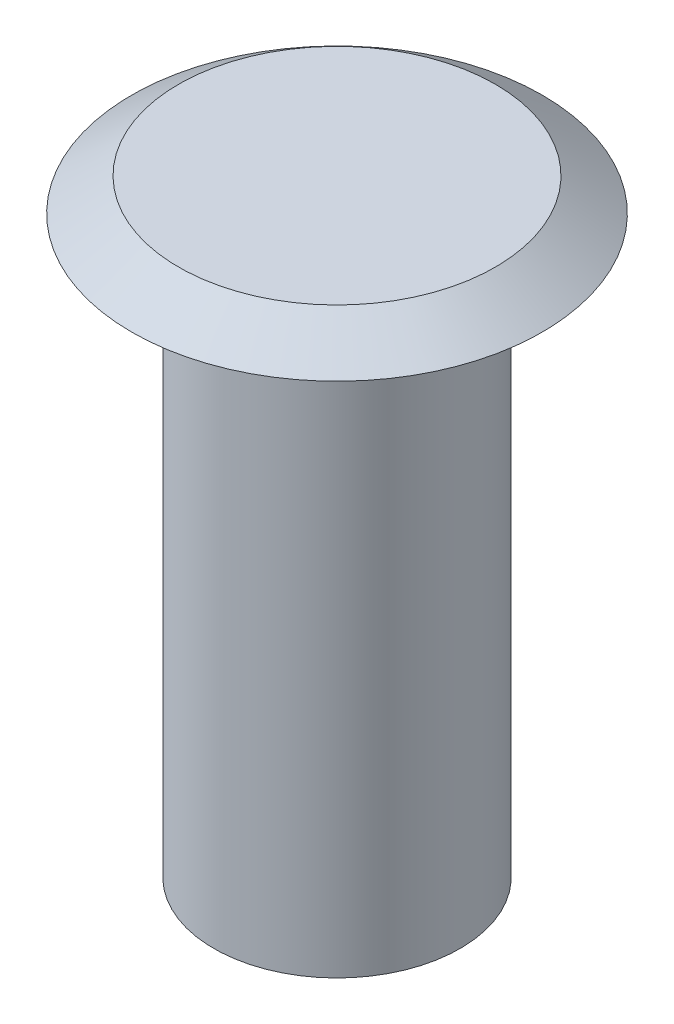
ISO-10303-21;
HEADER;
FILE_DESCRIPTION(('STEP AP214'),'2;1');
FILE_NAME('part.step','',(''),(''),'','','');
FILE_SCHEMA(('AUTOMOTIVE_DESIGN { 1 0 10303 214 1 1 1 1 }'));
ENDSEC;
DATA;
#1=APPLICATION_CONTEXT('core data for automotive mechanical design processes');
#2=APPLICATION_PROTOCOL_DEFINITION('international standard','automotive_design',2000,#1);
#3=PRODUCT_CONTEXT('',#1,'mechanical');
#4=PRODUCT('Part','Part','',(#3));
#5=PRODUCT_RELATED_PRODUCT_CATEGORY('part','',(#4));
#6=PRODUCT_DEFINITION_FORMATION('','',#4);
#7=PRODUCT_DEFINITION_CONTEXT('part definition',#1,'design');
#8=PRODUCT_DEFINITION('design','',#6,#7);
#9=PRODUCT_DEFINITION_SHAPE('','',#8);
#10=(LENGTH_UNIT() NAMED_UNIT(*) SI_UNIT(.MILLI.,.METRE.));
#11=(NAMED_UNIT(*) PLANE_ANGLE_UNIT() SI_UNIT($,.RADIAN.));
#12=(NAMED_UNIT(*) SI_UNIT($,.STERADIAN.) SOLID_ANGLE_UNIT());
#13=UNCERTAINTY_MEASURE_WITH_UNIT(LENGTH_MEASURE(1.E-05),#10,'distance_accuracy_value','');
#14=(GEOMETRIC_REPRESENTATION_CONTEXT(3) GLOBAL_UNCERTAINTY_ASSIGNED_CONTEXT((#13)) GLOBAL_UNIT_ASSIGNED_CONTEXT((#10,
#11,#12)) REPRESENTATION_CONTEXT('',''));
#15=CARTESIAN_POINT('',(0.,0.,0.));
#16=DIRECTION('',(0.,0.,1.));
#17=DIRECTION('',(1.,0.,0.));
#18=AXIS2_PLACEMENT_3D('',#15,#16,#17);
#19=CARTESIAN_POINT('',(0.,7.4,0.));
#20=DIRECTION('',(0.,-1.,0.));
#21=DIRECTION('',(0.,0.,-1.));
#22=AXIS2_PLACEMENT_3D('',#19,#20,#21);
#23=PLANE('',#22);
#24=CARTESIAN_POINT('',(0.,7.4,0.));
#25=DIRECTION('',(0.,-1.,0.));
#26=DIRECTION('',(0.,0.,-1.));
#27=AXIS2_PLACEMENT_3D('',#24,#25,#26);
#28=CIRCLE('',#27,1.92874079730315);
#29=CARTESIAN_POINT('',(0.,7.4,-1.92874079730315));
#30=VERTEX_POINT('',#29);
#31=EDGE_CURVE('E10',#30,#30,#28,.T.);
#32=ORIENTED_EDGE('',*,*,#31,.F.);
#33=EDGE_LOOP('',(#32));
#34=FACE_BOUND('',#33,.T.);
#35=ADVANCED_FACE('F39',(#34),#23,.F.);
#36=CARTESIAN_POINT('',(0.,7.4,0.));
#37=DIRECTION('',(0.,-1.,0.));
#38=DIRECTION('',(0.,0.,-1.));
#39=AXIS2_PLACEMENT_3D('',#36,#37,#38);
#40=CONICAL_SURFACE('',#39,1.92874079730315,0.959931088596887);
#41=CARTESIAN_POINT('',(0.,7.,0.));
#42=DIRECTION('',(0.,-1.,0.));
#43=DIRECTION('',(0.,0.,-1.));
#44=AXIS2_PLACEMENT_3D('',#41,#42,#43);
#45=CIRCLE('',#44,2.5);
#46=CARTESIAN_POINT('',(0.,7.,-2.5));
#47=VERTEX_POINT('',#46);
#48=EDGE_CURVE('E45',#47,#47,#45,.T.);
#49=ORIENTED_EDGE('',*,*,#48,.F.);
#50=EDGE_LOOP('',(#49));
#51=FACE_BOUND('',#50,.T.);
#52=ORIENTED_EDGE('',*,*,#31,.T.);
#53=EDGE_LOOP('',(#52));
#54=FACE_BOUND('',#53,.T.);
#55=ADVANCED_FACE('F87',(#51,#54),#40,.T.);
#56=CARTESIAN_POINT('',(-2.5,7.,0.));
#57=DIRECTION('',(0.,1.,0.));
#58=DIRECTION('',(0.,0.,1.));
#59=AXIS2_PLACEMENT_3D('',#56,#57,#58);
#60=PLANE('',#59);
#61=CARTESIAN_POINT('',(0.,7.,0.));
#62=DIRECTION('',(0.,-1.,0.));
#63=DIRECTION('',(0.,0.,-1.));
#64=AXIS2_PLACEMENT_3D('',#61,#62,#63);
#65=CIRCLE('',#64,1.5);
#66=CARTESIAN_POINT('',(0.,7.,-1.5));
#67=VERTEX_POINT('',#66);
#68=EDGE_CURVE('E49',#67,#67,#65,.T.);
#69=ORIENTED_EDGE('',*,*,#68,.F.);
#70=EDGE_LOOP('',(#69));
#71=FACE_BOUND('',#70,.T.);
#72=ORIENTED_EDGE('',*,*,#48,.T.);
#73=EDGE_LOOP('',(#72));
#74=FACE_BOUND('',#73,.T.);
#75=ADVANCED_FACE('F82',(#71,#74),#60,.F.);
#76=CARTESIAN_POINT('',(0.,0.,0.));
#77=DIRECTION('',(0.,-1.,0.));
#78=DIRECTION('',(0.,0.,-1.));
#79=AXIS2_PLACEMENT_3D('',#76,#77,#78);
#80=CYLINDRICAL_SURFACE('',#79,1.5);
#81=CARTESIAN_POINT('',(0.,0.,0.));
#82=DIRECTION('',(0.,-1.,0.));
#83=DIRECTION('',(0.,0.,-1.));
#84=AXIS2_PLACEMENT_3D('',#81,#82,#83);
#85=CIRCLE('',#84,1.5);
#86=CARTESIAN_POINT('',(0.,0.,-1.5));
#87=VERTEX_POINT('',#86);
#88=EDGE_CURVE('E53',#87,#87,#85,.T.);
#89=ORIENTED_EDGE('',*,*,#88,.F.);
#90=EDGE_LOOP('',(#89));
#91=FACE_BOUND('',#90,.T.);
#92=ORIENTED_EDGE('',*,*,#68,.T.);
#93=EDGE_LOOP('',(#92));
#94=FACE_BOUND('',#93,.T.);
#95=ADVANCED_FACE('F76',(#91,#94),#80,.T.);
#96=CARTESIAN_POINT('',(-1.5,0.,0.));
#97=DIRECTION('',(0.,1.,0.));
#98=DIRECTION('',(0.,0.,1.));
#99=AXIS2_PLACEMENT_3D('',#96,#97,#98);
#100=PLANE('',#99);
#101=CARTESIAN_POINT('',(0.,0.,0.));
#102=DIRECTION('',(0.,-1.,0.));
#103=DIRECTION('',(0.,0.,-1.));
#104=AXIS2_PLACEMENT_3D('',#101,#102,#103);
#105=CIRCLE('',#104,0.6);
#106=CARTESIAN_POINT('',(0.,0.,-0.6));
#107=VERTEX_POINT('',#106);
#108=EDGE_CURVE('E58',#107,#107,#105,.T.);
#109=ORIENTED_EDGE('',*,*,#108,.F.);
#110=EDGE_LOOP('',(#109));
#111=FACE_BOUND('',#110,.T.);
#112=ORIENTED_EDGE('',*,*,#88,.T.);
#113=EDGE_LOOP('',(#112));
#114=FACE_BOUND('',#113,.T.);
#115=ADVANCED_FACE('F70',(#111,#114),#100,.F.);
#116=CARTESIAN_POINT('',(0.,0.,0.));
#117=DIRECTION('',(0.,-1.,0.));
#118=DIRECTION('',(0.,0.,-1.));
#119=AXIS2_PLACEMENT_3D('',#116,#117,#118);
#120=CYLINDRICAL_SURFACE('',#119,0.6);
#121=CARTESIAN_POINT('',(0.,4.,0.));
#122=DIRECTION('',(0.,-1.,0.));
#123=DIRECTION('',(0.,0.,-1.));
#124=AXIS2_PLACEMENT_3D('',#121,#122,#123);
#125=CIRCLE('',#124,0.6);
#126=CARTESIAN_POINT('',(0.,4.,-0.6));
#127=VERTEX_POINT('',#126);
#128=EDGE_CURVE('E61',#127,#127,#125,.T.);
#129=ORIENTED_EDGE('',*,*,#128,.F.);
#130=EDGE_LOOP('',(#129));
#131=FACE_BOUND('',#130,.T.);
#132=ORIENTED_EDGE('',*,*,#108,.T.);
#133=EDGE_LOOP('',(#132));
#134=FACE_BOUND('',#133,.T.);
#135=ADVANCED_FACE('F67',(#131,#134),#120,.F.);
#136=CARTESIAN_POINT('',(-0.6,4.,0.));
#137=DIRECTION('',(0.,1.,0.));
#138=DIRECTION('',(0.,0.,1.));
#139=AXIS2_PLACEMENT_3D('',#136,#137,#138);
#140=PLANE('',#139);
#141=ORIENTED_EDGE('',*,*,#128,.T.);
#142=EDGE_LOOP('',(#141));
#143=FACE_BOUND('',#142,.T.);
#144=ADVANCED_FACE('F65',(#143),#140,.F.);
#145=CLOSED_SHELL('',(#35,#55,#75,#95,#115,#135,#144));
#146=MANIFOLD_SOLID_BREP('B2',#145);
#147=ADVANCED_BREP_SHAPE_REPRESENTATION('',(#18,#146),#14);
#148=SHAPE_DEFINITION_REPRESENTATION(#9,#147);
ENDSEC;
END-ISO-10303-21;
